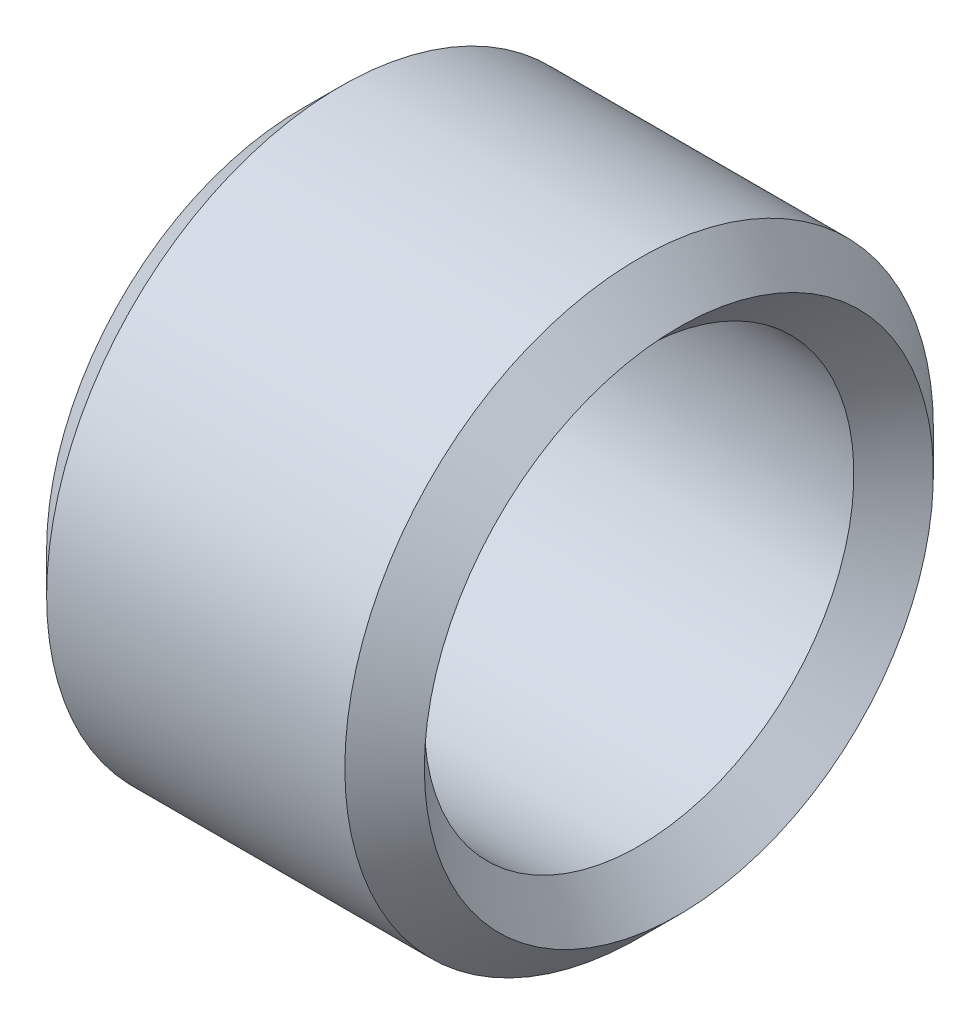
ISO-10303-21;
HEADER;
FILE_DESCRIPTION(('STEP AP214'),'2;1');
FILE_NAME('part.step','',(''),(''),'','','');
FILE_SCHEMA(('AUTOMOTIVE_DESIGN { 1 0 10303 214 1 1 1 1 }'));
ENDSEC;
DATA;
#1=APPLICATION_CONTEXT('core data for automotive mechanical design processes');
#2=APPLICATION_PROTOCOL_DEFINITION('international standard','automotive_design',2000,#1);
#3=PRODUCT_CONTEXT('',#1,'mechanical');
#4=PRODUCT('Part','Part','',(#3));
#5=PRODUCT_RELATED_PRODUCT_CATEGORY('part','',(#4));
#6=PRODUCT_DEFINITION_FORMATION('','',#4);
#7=PRODUCT_DEFINITION_CONTEXT('part definition',#1,'design');
#8=PRODUCT_DEFINITION('design','',#6,#7);
#9=PRODUCT_DEFINITION_SHAPE('','',#8);
#10=(LENGTH_UNIT() NAMED_UNIT(*) SI_UNIT(.MILLI.,.METRE.));
#11=(NAMED_UNIT(*) PLANE_ANGLE_UNIT() SI_UNIT($,.RADIAN.));
#12=(NAMED_UNIT(*) SI_UNIT($,.STERADIAN.) SOLID_ANGLE_UNIT());
#13=UNCERTAINTY_MEASURE_WITH_UNIT(LENGTH_MEASURE(1.E-05),#10,'distance_accuracy_value','');
#14=(GEOMETRIC_REPRESENTATION_CONTEXT(3) GLOBAL_UNCERTAINTY_ASSIGNED_CONTEXT((#13)) GLOBAL_UNIT_ASSIGNED_CONTEXT((#10,
#11,#12)) REPRESENTATION_CONTEXT('',''));
#15=CARTESIAN_POINT('',(0.,0.,0.));
#16=DIRECTION('',(0.,0.,1.));
#17=DIRECTION('',(1.,0.,0.));
#18=AXIS2_PLACEMENT_3D('',#15,#16,#17);
#19=CARTESIAN_POINT('',(-7.49999999999998,0.,0.));
#20=DIRECTION('',(-1.,0.,0.));
#21=DIRECTION('',(0.,0.,1.));
#22=AXIS2_PLACEMENT_3D('',#19,#20,#21);
#23=CONICAL_SURFACE('',#22,10.8027653179698,0.785398163397448);
#24=CARTESIAN_POINT('',(-9.49999999999996,0.,0.));
#25=DIRECTION('',(-1.,0.,0.));
#26=DIRECTION('',(0.,0.,1.));
#27=AXIS2_PLACEMENT_3D('',#24,#25,#26);
#28=CIRCLE('',#27,12.8027653179698);
#29=CARTESIAN_POINT('',(-9.49999999999996,0.,12.8027653179698));
#30=VERTEX_POINT('',#29);
#31=EDGE_CURVE('E54',#30,#30,#28,.T.);
#32=ORIENTED_EDGE('',*,*,#31,.T.);
#33=EDGE_LOOP('',(#32));
#34=FACE_BOUND('',#33,.T.);
#35=CARTESIAN_POINT('',(-7.49999999999998,0.,0.));
#36=DIRECTION('',(-1.,0.,0.));
#37=DIRECTION('',(0.,0.,1.));
#38=AXIS2_PLACEMENT_3D('',#35,#36,#37);
#39=CIRCLE('',#38,10.8027653179698);
#40=CARTESIAN_POINT('',(-7.49999999999998,0.,10.8027653179698));
#41=VERTEX_POINT('',#40);
#42=EDGE_CURVE('E10',#41,#41,#39,.T.);
#43=ORIENTED_EDGE('',*,*,#42,.F.);
#44=EDGE_LOOP('',(#43));
#45=FACE_BOUND('',#44,.T.);
#46=ADVANCED_FACE('F32',(#34,#45),#23,.F.);
#47=CARTESIAN_POINT('',(0.,0.,0.));
#48=DIRECTION('',(-1.,0.,0.));
#49=DIRECTION('',(0.,0.,1.));
#50=AXIS2_PLACEMENT_3D('',#47,#48,#49);
#51=CYLINDRICAL_SURFACE('',#50,10.8027653179698);
#52=ORIENTED_EDGE('',*,*,#42,.T.);
#53=EDGE_LOOP('',(#52));
#54=FACE_BOUND('',#53,.T.);
#55=CARTESIAN_POINT('',(7.49999999999998,0.,0.));
#56=DIRECTION('',(-1.,0.,0.));
#57=DIRECTION('',(0.,0.,1.));
#58=AXIS2_PLACEMENT_3D('',#55,#56,#57);
#59=CIRCLE('',#58,10.8027653179698);
#60=CARTESIAN_POINT('',(7.49999999999998,0.,10.8027653179698));
#61=VERTEX_POINT('',#60);
#62=EDGE_CURVE('E38',#61,#61,#59,.T.);
#63=ORIENTED_EDGE('',*,*,#62,.F.);
#64=EDGE_LOOP('',(#63));
#65=FACE_BOUND('',#64,.T.);
#66=ADVANCED_FACE('F72',(#54,#65),#51,.F.);
#67=CARTESIAN_POINT('',(9.49999999999996,0.,0.));
#68=DIRECTION('',(1.,0.,0.));
#69=DIRECTION('',(0.,0.,-1.));
#70=AXIS2_PLACEMENT_3D('',#67,#68,#69);
#71=CONICAL_SURFACE('',#70,12.8027653179698,0.785398163397448);
#72=ORIENTED_EDGE('',*,*,#62,.T.);
#73=EDGE_LOOP('',(#72));
#74=FACE_BOUND('',#73,.T.);
#75=CARTESIAN_POINT('',(9.49999999999996,0.,0.));
#76=DIRECTION('',(-1.,0.,0.));
#77=DIRECTION('',(0.,0.,1.));
#78=AXIS2_PLACEMENT_3D('',#75,#76,#77);
#79=CIRCLE('',#78,12.8027653179698);
#80=CARTESIAN_POINT('',(9.49999999999996,0.,12.8027653179698));
#81=VERTEX_POINT('',#80);
#82=EDGE_CURVE('E42',#81,#81,#79,.T.);
#83=ORIENTED_EDGE('',*,*,#82,.F.);
#84=EDGE_LOOP('',(#83));
#85=FACE_BOUND('',#84,.T.);
#86=ADVANCED_FACE('F76',(#74,#85),#71,.F.);
#87=CARTESIAN_POINT('',(7.49999999999998,0.,0.));
#88=DIRECTION('',(-1.,0.,0.));
#89=DIRECTION('',(0.,0.,1.));
#90=AXIS2_PLACEMENT_3D('',#87,#88,#89);
#91=CONICAL_SURFACE('',#90,14.8027653179698,0.785398163397449);
#92=ORIENTED_EDGE('',*,*,#82,.T.);
#93=EDGE_LOOP('',(#92));
#94=FACE_BOUND('',#93,.T.);
#95=CARTESIAN_POINT('',(7.49999999999998,0.,0.));
#96=DIRECTION('',(-1.,0.,0.));
#97=DIRECTION('',(0.,0.,1.));
#98=AXIS2_PLACEMENT_3D('',#95,#96,#97);
#99=CIRCLE('',#98,14.8027653179698);
#100=CARTESIAN_POINT('',(7.49999999999998,0.,14.8027653179698));
#101=VERTEX_POINT('',#100);
#102=EDGE_CURVE('E46',#101,#101,#99,.T.);
#103=ORIENTED_EDGE('',*,*,#102,.F.);
#104=EDGE_LOOP('',(#103));
#105=FACE_BOUND('',#104,.T.);
#106=ADVANCED_FACE('F68',(#94,#105),#91,.T.);
#107=CARTESIAN_POINT('',(0.,0.,0.));
#108=DIRECTION('',(-1.,0.,0.));
#109=DIRECTION('',(0.,0.,1.));
#110=AXIS2_PLACEMENT_3D('',#107,#108,#109);
#111=CYLINDRICAL_SURFACE('',#110,14.8027653179698);
#112=ORIENTED_EDGE('',*,*,#102,.T.);
#113=EDGE_LOOP('',(#112));
#114=FACE_BOUND('',#113,.T.);
#115=CARTESIAN_POINT('',(-7.49999999999998,0.,0.));
#116=DIRECTION('',(-1.,0.,0.));
#117=DIRECTION('',(0.,0.,1.));
#118=AXIS2_PLACEMENT_3D('',#115,#116,#117);
#119=CIRCLE('',#118,14.8027653179698);
#120=CARTESIAN_POINT('',(-7.49999999999998,0.,14.8027653179698));
#121=VERTEX_POINT('',#120);
#122=EDGE_CURVE('E51',#121,#121,#119,.T.);
#123=ORIENTED_EDGE('',*,*,#122,.F.);
#124=EDGE_LOOP('',(#123));
#125=FACE_BOUND('',#124,.T.);
#126=ADVANCED_FACE('F62',(#114,#125),#111,.T.);
#127=CARTESIAN_POINT('',(-9.49999999999996,0.,0.));
#128=DIRECTION('',(1.,0.,0.));
#129=DIRECTION('',(0.,0.,-1.));
#130=AXIS2_PLACEMENT_3D('',#127,#128,#129);
#131=CONICAL_SURFACE('',#130,12.8027653179698,0.78539816339745);
#132=ORIENTED_EDGE('',*,*,#122,.T.);
#133=EDGE_LOOP('',(#132));
#134=FACE_BOUND('',#133,.T.);
#135=ORIENTED_EDGE('',*,*,#31,.F.);
#136=EDGE_LOOP('',(#135));
#137=FACE_BOUND('',#136,.T.);
#138=ADVANCED_FACE('F60',(#134,#137),#131,.T.);
#139=CLOSED_SHELL('',(#46,#66,#86,#106,#126,#138));
#140=MANIFOLD_SOLID_BREP('B2',#139);
#141=ADVANCED_BREP_SHAPE_REPRESENTATION('',(#18,#140),#14);
#142=SHAPE_DEFINITION_REPRESENTATION(#9,#141);
ENDSEC;
END-ISO-10303-21;
